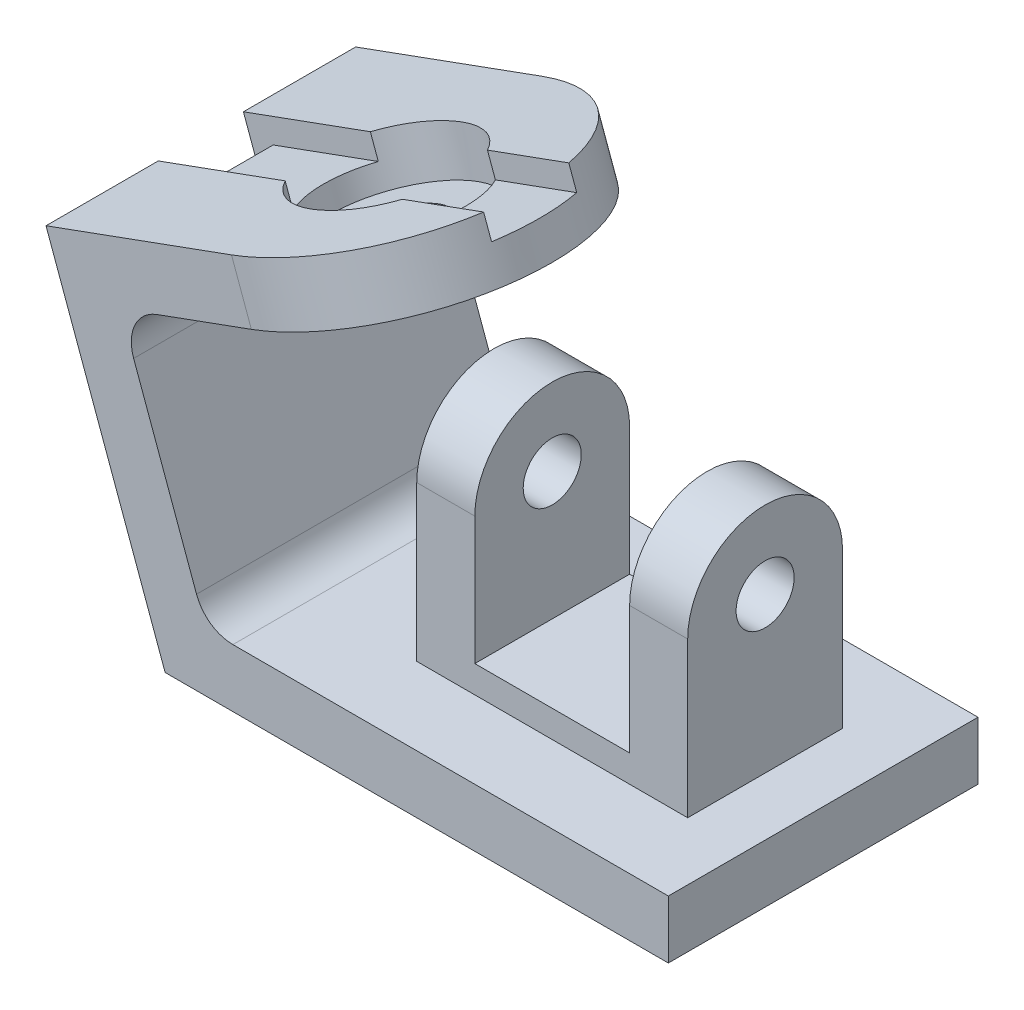
ISO-10303-21;
HEADER;
FILE_DESCRIPTION(('STEP AP214'),'2;1');
FILE_NAME('part.step','',(''),(''),'','','');
FILE_SCHEMA(('AUTOMOTIVE_DESIGN { 1 0 10303 214 1 1 1 1 }'));
ENDSEC;
DATA;
#1=APPLICATION_CONTEXT('core data for automotive mechanical design processes');
#2=APPLICATION_PROTOCOL_DEFINITION('international standard','automotive_design',2000,#1);
#3=PRODUCT_CONTEXT('',#1,'mechanical');
#4=PRODUCT('Part','Part','',(#3));
#5=PRODUCT_RELATED_PRODUCT_CATEGORY('part','',(#4));
#6=PRODUCT_DEFINITION_FORMATION('','',#4);
#7=PRODUCT_DEFINITION_CONTEXT('part definition',#1,'design');
#8=PRODUCT_DEFINITION('design','',#6,#7);
#9=PRODUCT_DEFINITION_SHAPE('','',#8);
#10=(LENGTH_UNIT() NAMED_UNIT(*) SI_UNIT(.MILLI.,.METRE.));
#11=(NAMED_UNIT(*) PLANE_ANGLE_UNIT() SI_UNIT($,.RADIAN.));
#12=(NAMED_UNIT(*) SI_UNIT($,.STERADIAN.) SOLID_ANGLE_UNIT());
#13=UNCERTAINTY_MEASURE_WITH_UNIT(LENGTH_MEASURE(1.E-05),#10,'distance_accuracy_value','');
#14=(GEOMETRIC_REPRESENTATION_CONTEXT(3) GLOBAL_UNCERTAINTY_ASSIGNED_CONTEXT((#13)) GLOBAL_UNIT_ASSIGNED_CONTEXT((#10,
#11,#12)) REPRESENTATION_CONTEXT('',''));
#15=CARTESIAN_POINT('',(0.,0.,0.));
#16=DIRECTION('',(0.,0.,1.));
#17=DIRECTION('',(1.,0.,0.));
#18=AXIS2_PLACEMENT_3D('',#15,#16,#17);
#19=CARTESIAN_POINT('',(45.,55.,-40.));
#20=DIRECTION('',(1.,0.,0.));
#21=DIRECTION('',(0.,0.,-1.));
#22=AXIS2_PLACEMENT_3D('',#19,#20,#21);
#23=CYLINDRICAL_SURFACE('',#22,20.);
#24=CARTESIAN_POINT('',(60.,55.,-40.));
#25=DIRECTION('',(-1.,0.,0.));
#26=DIRECTION('',(0.,0.,1.));
#27=AXIS2_PLACEMENT_3D('',#24,#25,#26);
#28=CIRCLE('',#27,20.);
#29=CARTESIAN_POINT('',(60.,55.,-60.));
#30=VERTEX_POINT('',#29);
#31=CARTESIAN_POINT('',(60.,55.,-20.));
#32=VERTEX_POINT('',#31);
#33=EDGE_CURVE('E235',#30,#32,#28,.F.);
#34=ORIENTED_EDGE('',*,*,#33,.F.);
#35=DIRECTION('',(1.,0.,0.));
#36=VECTOR('',#35,1.);
#37=CARTESIAN_POINT('',(45.,55.,-60.));
#38=LINE('',#37,#36);
#39=CARTESIAN_POINT('',(45.,55.,-60.));
#40=VERTEX_POINT('',#39);
#41=EDGE_CURVE('E309',#40,#30,#38,.T.);
#42=ORIENTED_EDGE('',*,*,#41,.F.);
#43=CARTESIAN_POINT('',(45.,55.,-40.));
#44=DIRECTION('',(1.,0.,0.));
#45=DIRECTION('',(0.,0.,1.));
#46=AXIS2_PLACEMENT_3D('',#43,#44,#45);
#47=CIRCLE('',#46,20.);
#48=CARTESIAN_POINT('',(45.,55.,-20.));
#49=VERTEX_POINT('',#48);
#50=EDGE_CURVE('E278',#40,#49,#47,.T.);
#51=ORIENTED_EDGE('',*,*,#50,.T.);
#52=DIRECTION('',(1.,0.,0.));
#53=VECTOR('',#52,1.);
#54=CARTESIAN_POINT('',(45.,55.,-20.));
#55=LINE('',#54,#53);
#56=EDGE_CURVE('E305',#49,#32,#55,.T.);
#57=ORIENTED_EDGE('',*,*,#56,.T.);
#58=EDGE_LOOP('',(#34,#42,#51,#57));
#59=FACE_BOUND('',#58,.T.);
#60=ADVANCED_FACE('F43',(#59),#23,.T.);
#61=CARTESIAN_POINT('',(19.1946316207254,96.3772074556254,-40.));
#62=DIRECTION('',(-0.342020143325666,0.939692620785909,0.));
#63=DIRECTION('',(-0.939692620785909,-0.342020143325666,0.));
#64=AXIS2_PLACEMENT_3D('',#61,#62,#63);
#65=PLANE('',#64);
#66=DIRECTION('',(-0.939692620785909,-0.342020143325666,0.));
#67=VECTOR('',#66,1.);
#68=CARTESIAN_POINT('',(-28.729692039356,78.9341801460164,-51.));
#69=LINE('',#68,#67);
#70=CARTESIAN_POINT('',(4.06441315107677,90.8702582947286,-51.));
#71=VERTEX_POINT('',#70);
#72=CARTESIAN_POINT('',(-23.0915363146405,80.9863010059704,-51.));
#73=VERTEX_POINT('',#72);
#74=EDGE_CURVE('E367',#71,#73,#69,.T.);
#75=ORIENTED_EDGE('',*,*,#74,.T.);
#76=DIRECTION('',(0.,0.,1.));
#77=VECTOR('',#76,1.);
#78=CARTESIAN_POINT('',(-23.0915363146405,80.9863010059704,-40.));
#79=LINE('',#78,#77);
#80=CARTESIAN_POINT('',(-23.0915363146405,80.9863010059704,-29.));
#81=VERTEX_POINT('',#80);
#82=EDGE_CURVE('E335',#73,#81,#79,.T.);
#83=ORIENTED_EDGE('',*,*,#82,.T.);
#84=DIRECTION('',(0.939692620785909,0.342020143325666,0.));
#85=VECTOR('',#84,1.);
#86=CARTESIAN_POINT('',(-28.729692039356,78.9341801460164,-29.));
#87=LINE('',#86,#85);
#88=CARTESIAN_POINT('',(4.06441315107677,90.8702582947286,-29.));
#89=VERTEX_POINT('',#88);
#90=EDGE_CURVE('E374',#81,#89,#87,.T.);
#91=ORIENTED_EDGE('',*,*,#90,.T.);
#92=CARTESIAN_POINT('',(19.1946316207254,96.3772074556254,-40.));
#93=DIRECTION('',(-0.342020143325666,0.939692620785909,0.));
#94=DIRECTION('',(-0.939692620785909,-0.342020143325666,0.));
#95=AXIS2_PLACEMENT_3D('',#92,#93,#94);
#96=CIRCLE('',#95,19.5);
#97=EDGE_CURVE('E354',#71,#89,#96,.T.);
#98=ORIENTED_EDGE('',*,*,#97,.F.);
#99=EDGE_LOOP('',(#75,#83,#91,#98));
#100=FACE_BOUND('',#99,.T.);
#101=ADVANCED_FACE('F613',(#100),#65,.T.);
#102=CARTESIAN_POINT('',(63.1318732289309,-24.3393717360423,-40.));
#103=DIRECTION('',(-0.342020143325666,0.939692620785909,0.));
#104=DIRECTION('',(-0.939692620785909,-0.342020143325666,0.));
#105=AXIS2_PLACEMENT_3D('',#102,#103,#104);
#106=CYLINDRICAL_SURFACE('',#105,9.5);
#107=CARTESIAN_POINT('',(22.2728129106564,87.9199738685522,-40.));
#108=DIRECTION('',(0.342020143325666,-0.939692620785909,0.));
#109=DIRECTION('',(0.939692620785909,0.342020143325666,0.));
#110=AXIS2_PLACEMENT_3D('',#107,#108,#109);
#111=CIRCLE('',#110,9.5);
#112=CARTESIAN_POINT('',(31.1998928081226,91.169165230146,-40.));
#113=VERTEX_POINT('',#112);
#114=EDGE_CURVE('E390',#113,#113,#111,.F.);
#115=ORIENTED_EDGE('',*,*,#114,.F.);
#116=EDGE_LOOP('',(#115));
#117=FACE_BOUND('',#116,.T.);
#118=CARTESIAN_POINT('',(21.2467524806794,90.7390517309099,-40.));
#119=DIRECTION('',(-0.342020143325666,0.939692620785909,0.));
#120=DIRECTION('',(-0.939692620785909,-0.342020143325666,0.));
#121=AXIS2_PLACEMENT_3D('',#118,#119,#120);
#122=CIRCLE('',#121,9.5);
#123=CARTESIAN_POINT('',(12.3196725832133,87.4898603693161,-40.));
#124=VERTEX_POINT('',#123);
#125=EDGE_CURVE('E362',#124,#124,#122,.F.);
#126=ORIENTED_EDGE('',*,*,#125,.F.);
#127=EDGE_LOOP('',(#126));
#128=FACE_BOUND('',#127,.T.);
#129=ADVANCED_FACE('F618',(#117,#128),#106,.F.);
#130=CARTESIAN_POINT('',(34.3248500903741,101.884156616522,-29.));
#131=VERTEX_POINT('',#130);
#132=CARTESIAN_POINT('',(34.3248500903741,101.884156616522,-51.));
#133=VERTEX_POINT('',#132);
#134=EDGE_CURVE('E347',#131,#133,#96,.T.);
#135=ORIENTED_EDGE('',*,*,#134,.F.);
#136=CARTESIAN_POINT('',(55.3331134051957,109.530539136744,-29.));
#137=VERTEX_POINT('',#136);
#138=EDGE_CURVE('E373',#131,#137,#87,.T.);
#139=ORIENTED_EDGE('',*,*,#138,.T.);
#140=CARTESIAN_POINT('',(19.1946316207254,96.3772074556254,-40.));
#141=DIRECTION('',(-0.342020143325666,0.939692620785909,0.));
#142=DIRECTION('',(-0.939692620785909,-0.342020143325666,0.));
#143=AXIS2_PLACEMENT_3D('',#140,#141,#142);
#144=CIRCLE('',#143,40.);
#145=CARTESIAN_POINT('',(55.3331134051957,109.530539136744,-51.));
#146=VERTEX_POINT('',#145);
#147=EDGE_CURVE('E363',#137,#146,#144,.T.);
#148=ORIENTED_EDGE('',*,*,#147,.T.);
#149=EDGE_CURVE('E369',#146,#133,#69,.T.);
#150=ORIENTED_EDGE('',*,*,#149,.T.);
#151=EDGE_LOOP('',(#135,#139,#148,#150));
#152=FACE_BOUND('',#151,.T.);
#153=ADVANCED_FACE('F621',(#152),#65,.T.);
#154=CARTESIAN_POINT('',(-28.729692039356,78.9341801460164,-29.));
#155=DIRECTION('',(0.,0.,1.));
#156=DIRECTION('',(1.,0.,0.));
#157=AXIS2_PLACEMENT_3D('',#154,#155,#156);
#158=PLANE('',#157);
#159=ORIENTED_EDGE('',*,*,#138,.F.);
#160=DIRECTION('',(-0.342020143325666,0.939692620785909,0.));
#161=VECTOR('',#160,1.);
#162=CARTESIAN_POINT('',(36.3769709503281,96.2460008918067,-29.));
#163=LINE('',#162,#161);
#164=CARTESIAN_POINT('',(32.2727292304201,107.522312341238,-29.));
#165=VERTEX_POINT('',#164);
#166=EDGE_CURVE('E353',#131,#165,#163,.T.);
#167=ORIENTED_EDGE('',*,*,#166,.T.);
#168=DIRECTION('',(0.939692620785909,0.342020143325666,0.));
#169=VECTOR('',#168,1.);
#170=CARTESIAN_POINT('',(-30.78181289931,84.5723358707319,-29.));
#171=LINE('',#170,#169);
#172=CARTESIAN_POINT('',(53.2809925452417,115.168694861459,-29.));
#173=VERTEX_POINT('',#172);
#174=EDGE_CURVE('E382',#165,#173,#171,.T.);
#175=ORIENTED_EDGE('',*,*,#174,.T.);
#176=DIRECTION('',(-0.342020143325666,0.939692620785909,0.));
#177=VECTOR('',#176,1.);
#178=CARTESIAN_POINT('',(55.3331134051957,109.530539136744,-29.));
#179=LINE('',#178,#177);
#180=EDGE_CURVE('E386',#137,#173,#179,.T.);
#181=ORIENTED_EDGE('',*,*,#180,.F.);
#182=EDGE_LOOP('',(#159,#167,#175,#181));
#183=FACE_BOUND('',#182,.T.);
#184=ADVANCED_FACE('F716',(#183),#158,.F.);
#185=CARTESIAN_POINT('',(-28.729692039356,78.9341801460164,-51.));
#186=DIRECTION('',(0.,0.,-1.));
#187=DIRECTION('',(-1.,0.,0.));
#188=AXIS2_PLACEMENT_3D('',#185,#186,#187);
#189=PLANE('',#188);
#190=DIRECTION('',(-0.342020143325666,0.939692620785909,0.));
#191=VECTOR('',#190,1.);
#192=CARTESIAN_POINT('',(-28.729692039356,78.9341801460164,-51.));
#193=LINE('',#192,#191);
#194=CARTESIAN_POINT('',(-11.6286848730727,31.949549106721,-51.));
#195=VERTEX_POINT('',#194);
#196=CARTESIAN_POINT('',(-30.78181289931,84.5723358707319,-51.));
#197=VERTEX_POINT('',#196);
#198=EDGE_CURVE('E394',#195,#197,#193,.T.);
#199=ORIENTED_EDGE('',*,*,#198,.F.);
#200=DIRECTION('',(-0.939692620785909,-0.342020143325666,0.));
#201=VECTOR('',#200,1.);
#202=CARTESIAN_POINT('',(-5.99052914835721,34.0016699666749,-51.));
#203=LINE('',#202,#201);
#204=CARTESIAN_POINT('',(-5.99052914835721,34.0016699666749,-51.));
#205=VERTEX_POINT('',#204);
#206=EDGE_CURVE('E327',#205,#195,#203,.T.);
#207=ORIENTED_EDGE('',*,*,#206,.F.);
#208=DIRECTION('',(0.342020143325666,-0.939692620785909,0.));
#209=VECTOR('',#208,1.);
#210=CARTESIAN_POINT('',(-25.1436571745945,86.6244567306859,-51.));
#211=LINE('',#210,#209);
#212=EDGE_CURVE('E320',#73,#205,#211,.T.);
#213=ORIENTED_EDGE('',*,*,#212,.F.);
#214=ORIENTED_EDGE('',*,*,#74,.F.);
#215=DIRECTION('',(-0.342020143325666,0.939692620785909,0.));
#216=VECTOR('',#215,1.);
#217=CARTESIAN_POINT('',(6.11653401103077,85.2321025700131,-51.));
#218=LINE('',#217,#216);
#219=CARTESIAN_POINT('',(2.01229229112277,96.508414019444,-51.));
#220=VERTEX_POINT('',#219);
#221=EDGE_CURVE('E491',#71,#220,#218,.T.);
#222=ORIENTED_EDGE('',*,*,#221,.T.);
#223=DIRECTION('',(-0.939692620785909,-0.342020143325666,0.));
#224=VECTOR('',#223,1.);
#225=CARTESIAN_POINT('',(-30.78181289931,84.5723358707319,-51.));
#226=LINE('',#225,#224);
#227=EDGE_CURVE('E383',#220,#197,#226,.T.);
#228=ORIENTED_EDGE('',*,*,#227,.T.);
#229=EDGE_LOOP('',(#199,#207,#213,#214,#222,#228));
#230=FACE_BOUND('',#229,.T.);
#231=ADVANCED_FACE('F713',(#230),#189,.F.);
#232=CARTESIAN_POINT('',(-30.78181289931,84.5723358707318,-80.));
#233=DIRECTION('',(-0.342020143325666,0.939692620785909,0.));
#234=DIRECTION('',(-0.939692620785909,-0.342020143325666,0.));
#235=AXIS2_PLACEMENT_3D('',#232,#233,#234);
#236=PLANE('',#235);
#237=CARTESIAN_POINT('',(17.1425107607714,102.015363180341,-40.));
#238=DIRECTION('',(-0.342020143325666,0.939692620785909,0.));
#239=DIRECTION('',(-0.939692620785909,-0.342020143325666,0.));
#240=AXIS2_PLACEMENT_3D('',#237,#238,#239);
#241=CIRCLE('',#240,19.5);
#242=CARTESIAN_POINT('',(2.01229229112277,96.508414019444,-29.));
#243=VERTEX_POINT('',#242);
#244=EDGE_CURVE('E348',#243,#165,#241,.T.);
#245=ORIENTED_EDGE('',*,*,#244,.F.);
#246=CARTESIAN_POINT('',(-30.78181289931,84.5723358707319,-29.));
#247=VERTEX_POINT('',#246);
#248=EDGE_CURVE('E368',#247,#243,#171,.T.);
#249=ORIENTED_EDGE('',*,*,#248,.F.);
#250=DIRECTION('',(0.,0.,1.));
#251=VECTOR('',#250,1.);
#252=CARTESIAN_POINT('',(-30.78181289931,84.5723358707318,-80.));
#253=LINE('',#252,#251);
#254=CARTESIAN_POINT('',(-30.78181289931,84.5723358707318,0.));
#255=VERTEX_POINT('',#254);
#256=EDGE_CURVE('E482',#247,#255,#253,.T.);
#257=ORIENTED_EDGE('',*,*,#256,.T.);
#258=DIRECTION('',(-0.939692620785909,-0.342020143325666,0.));
#259=VECTOR('',#258,1.);
#260=CARTESIAN_POINT('',(-30.78181289931,84.5723358707318,0.));
#261=LINE('',#260,#259);
#262=CARTESIAN_POINT('',(17.1425107607714,102.015363180341,0.));
#263=VERTEX_POINT('',#262);
#264=EDGE_CURVE('E467',#263,#255,#261,.T.);
#265=ORIENTED_EDGE('',*,*,#264,.F.);
#266=CARTESIAN_POINT('',(17.1425107607714,102.015363180341,-40.));
#267=DIRECTION('',(-0.342020143325666,0.939692620785909,0.));
#268=DIRECTION('',(0.939692620785909,0.342020143325666,0.));
#269=AXIS2_PLACEMENT_3D('',#266,#267,#268);
#270=CIRCLE('',#269,40.);
#271=EDGE_CURVE('E409',#263,#173,#270,.T.);
#272=ORIENTED_EDGE('',*,*,#271,.T.);
#273=ORIENTED_EDGE('',*,*,#174,.F.);
#274=EDGE_LOOP('',(#245,#249,#257,#265,#272,#273));
#275=FACE_BOUND('',#274,.T.);
#276=ADVANCED_FACE('F684',(#275),#236,.T.);
#277=CARTESIAN_POINT('',(130.,0.,-80.));
#278=DIRECTION('',(0.,-1.,0.));
#279=DIRECTION('',(1.,0.,0.));
#280=AXIS2_PLACEMENT_3D('',#277,#278,#279);
#281=PLANE('',#280);
#282=DIRECTION('',(1.,0.,0.));
#283=VECTOR('',#282,1.);
#284=CARTESIAN_POINT('',(130.,0.,0.));
#285=LINE('',#284,#283);
#286=CARTESIAN_POINT('',(0.,0.,0.));
#287=VERTEX_POINT('',#286);
#288=CARTESIAN_POINT('',(130.,0.,0.));
#289=VERTEX_POINT('',#288);
#290=EDGE_CURVE('E408',#287,#289,#285,.T.);
#291=ORIENTED_EDGE('',*,*,#290,.F.);
#292=DIRECTION('',(0.,0.,1.));
#293=VECTOR('',#292,1.);
#294=CARTESIAN_POINT('',(0.,0.,-80.));
#295=LINE('',#294,#293);
#296=CARTESIAN_POINT('',(0.,0.,-80.));
#297=VERTEX_POINT('',#296);
#298=EDGE_CURVE('E474',#297,#287,#295,.T.);
#299=ORIENTED_EDGE('',*,*,#298,.F.);
#300=DIRECTION('',(1.,0.,0.));
#301=VECTOR('',#300,1.);
#302=CARTESIAN_POINT('',(130.,0.,-80.));
#303=LINE('',#302,#301);
#304=CARTESIAN_POINT('',(130.,0.,-80.));
#305=VERTEX_POINT('',#304);
#306=EDGE_CURVE('E413',#297,#305,#303,.T.);
#307=ORIENTED_EDGE('',*,*,#306,.T.);
#308=DIRECTION('',(0.,0.,1.));
#309=VECTOR('',#308,1.);
#310=CARTESIAN_POINT('',(130.,0.,-80.));
#311=LINE('',#310,#309);
#312=EDGE_CURVE('E444',#305,#289,#311,.T.);
#313=ORIENTED_EDGE('',*,*,#312,.T.);
#314=EDGE_LOOP('',(#291,#299,#307,#313));
#315=FACE_BOUND('',#314,.T.);
#316=ADVANCED_FACE('F549',(#315),#281,.T.);
#317=CARTESIAN_POINT('',(0.,0.,-80.));
#318=DIRECTION('',(-0.939692620785909,-0.342020143325666,0.));
#319=DIRECTION('',(0.342020143325666,-0.939692620785909,0.));
#320=AXIS2_PLACEMENT_3D('',#317,#318,#319);
#321=PLANE('',#320);
#322=DIRECTION('',(-0.342020143325666,0.939692620785909,0.));
#323=VECTOR('',#322,1.);
#324=CARTESIAN_POINT('',(-28.729692039356,78.9341801460164,-29.));
#325=LINE('',#324,#323);
#326=CARTESIAN_POINT('',(-11.6286848730727,31.949549106721,-29.));
#327=VERTEX_POINT('',#326);
#328=EDGE_CURVE('E391',#327,#247,#325,.T.);
#329=ORIENTED_EDGE('',*,*,#328,.F.);
#330=DIRECTION('',(0.,0.,1.));
#331=VECTOR('',#330,1.);
#332=CARTESIAN_POINT('',(-11.6286848730727,31.949549106721,-51.));
#333=LINE('',#332,#331);
#334=EDGE_CURVE('E304',#195,#327,#333,.T.);
#335=ORIENTED_EDGE('',*,*,#334,.F.);
#336=ORIENTED_EDGE('',*,*,#198,.T.);
#337=CARTESIAN_POINT('',(-30.78181289931,84.5723358707318,-80.));
#338=VERTEX_POINT('',#337);
#339=EDGE_CURVE('E478',#338,#197,#253,.T.);
#340=ORIENTED_EDGE('',*,*,#339,.F.);
#341=DIRECTION('',(0.342020143325666,-0.939692620785909,0.));
#342=VECTOR('',#341,1.);
#343=CARTESIAN_POINT('',(0.,0.,-80.));
#344=LINE('',#343,#342);
#345=EDGE_CURVE('E440',#338,#297,#344,.T.);
#346=ORIENTED_EDGE('',*,*,#345,.T.);
#347=ORIENTED_EDGE('',*,*,#298,.T.);
#348=DIRECTION('',(0.342020143325666,-0.939692620785909,0.));
#349=VECTOR('',#348,1.);
#350=CARTESIAN_POINT('',(0.,0.,0.));
#351=LINE('',#350,#349);
#352=EDGE_CURVE('E418',#255,#287,#351,.T.);
#353=ORIENTED_EDGE('',*,*,#352,.F.);
#354=ORIENTED_EDGE('',*,*,#256,.F.);
#355=EDGE_LOOP('',(#329,#335,#336,#340,#346,#347,#353,#354));
#356=FACE_BOUND('',#355,.T.);
#357=ADVANCED_FACE('F553',(#356),#321,.T.);
#358=CARTESIAN_POINT('',(32.2727292304201,107.522312341238,-51.));
#359=VERTEX_POINT('',#358);
#360=EDGE_CURVE('E342',#359,#220,#241,.T.);
#361=ORIENTED_EDGE('',*,*,#360,.F.);
#362=CARTESIAN_POINT('',(53.2809925452417,115.168694861459,-51.));
#363=VERTEX_POINT('',#362);
#364=EDGE_CURVE('E378',#363,#359,#226,.T.);
#365=ORIENTED_EDGE('',*,*,#364,.F.);
#366=CARTESIAN_POINT('',(17.1425107607714,102.015363180341,-80.));
#367=VERTEX_POINT('',#366);
#368=EDGE_CURVE('E403',#363,#367,#270,.T.);
#369=ORIENTED_EDGE('',*,*,#368,.T.);
#370=DIRECTION('',(-0.939692620785909,-0.342020143325666,0.));
#371=VECTOR('',#370,1.);
#372=CARTESIAN_POINT('',(-30.78181289931,84.5723358707318,-80.));
#373=LINE('',#372,#371);
#374=EDGE_CURVE('E436',#367,#338,#373,.T.);
#375=ORIENTED_EDGE('',*,*,#374,.T.);
#376=ORIENTED_EDGE('',*,*,#339,.T.);
#377=ORIENTED_EDGE('',*,*,#227,.F.);
#378=EDGE_LOOP('',(#361,#365,#369,#375,#376,#377));
#379=FACE_BOUND('',#378,.T.);
#380=ADVANCED_FACE('F559',(#379),#236,.T.);
#381=CARTESIAN_POINT('',(22.2728129106564,87.9199738685522,-80.));
#382=DIRECTION('',(0.342020143325666,-0.939692620785909,0.));
#383=DIRECTION('',(0.939692620785909,0.342020143325666,0.));
#384=AXIS2_PLACEMENT_3D('',#381,#382,#383);
#385=PLANE('',#384);
#386=ORIENTED_EDGE('',*,*,#114,.T.);
#387=EDGE_LOOP('',(#386));
#388=FACE_BOUND('',#387,.T.);
#389=DIRECTION('',(0.939692620785909,0.342020143325666,0.));
#390=VECTOR('',#389,1.);
#391=CARTESIAN_POINT('',(22.2728129106564,87.9199738685522,0.));
#392=LINE('',#391,#390);
#393=CARTESIAN_POINT('',(-2.15919522977722,79.0274501420848,0.));
#394=VERTEX_POINT('',#393);
#395=CARTESIAN_POINT('',(22.2728129106564,87.9199738685522,0.));
#396=VERTEX_POINT('',#395);
#397=EDGE_CURVE('E460',#394,#396,#392,.T.);
#398=ORIENTED_EDGE('',*,*,#397,.F.);
#399=DIRECTION('',(0.,0.,1.));
#400=VECTOR('',#399,1.);
#401=CARTESIAN_POINT('',(-2.15919522977723,79.0274501420848,-80.));
#402=LINE('',#401,#400);
#403=CARTESIAN_POINT('',(-2.15919522977722,79.0274501420848,-80.));
#404=VERTEX_POINT('',#403);
#405=EDGE_CURVE('E520',#394,#404,#402,.F.);
#406=ORIENTED_EDGE('',*,*,#405,.T.);
#407=DIRECTION('',(0.939692620785909,0.342020143325666,0.));
#408=VECTOR('',#407,1.);
#409=CARTESIAN_POINT('',(22.2728129106564,87.9199738685522,-80.));
#410=LINE('',#409,#408);
#411=CARTESIAN_POINT('',(22.2728129106564,87.9199738685522,-80.));
#412=VERTEX_POINT('',#411);
#413=EDGE_CURVE('E429',#404,#412,#410,.T.);
#414=ORIENTED_EDGE('',*,*,#413,.T.);
#415=CARTESIAN_POINT('',(22.2728129106564,87.9199738685522,-40.));
#416=DIRECTION('',(-0.342020143325666,0.939692620785909,0.));
#417=DIRECTION('',(0.939692620785909,0.342020143325666,0.));
#418=AXIS2_PLACEMENT_3D('',#415,#416,#417);
#419=CIRCLE('',#418,40.);
#420=EDGE_CURVE('E404',#396,#412,#419,.T.);
#421=ORIENTED_EDGE('',*,*,#420,.F.);
#422=EDGE_LOOP('',(#398,#406,#414,#421));
#423=FACE_BOUND('',#422,.T.);
#424=ADVANCED_FACE('F572',(#388,#423),#385,.T.);
#425=CARTESIAN_POINT('',(-11.5561214376363,75.6072487088282,-80.));
#426=DIRECTION('',(0.939692620785909,0.342020143325667,0.));
#427=DIRECTION('',(-0.342020143325667,0.939692620785909,0.));
#428=AXIS2_PLACEMENT_3D('',#425,#426,#427);
#429=PLANE('',#428);
#430=DIRECTION('',(-0.342020143325667,0.939692620785909,0.));
#431=VECTOR('',#430,1.);
#432=CARTESIAN_POINT('',(-11.5561214376363,75.6072487088282,-80.));
#433=LINE('',#432,#431);
#434=CARTESIAN_POINT('',(8.10826224738373,21.5797985667433,-80.));
#435=VERTEX_POINT('',#434);
#436=CARTESIAN_POINT('',(-8.13592000437966,66.2103225009691,-80.));
#437=VERTEX_POINT('',#436);
#438=EDGE_CURVE('E425',#435,#437,#433,.T.);
#439=ORIENTED_EDGE('',*,*,#438,.T.);
#440=DIRECTION('',(0.,0.,1.));
#441=VECTOR('',#440,1.);
#442=CARTESIAN_POINT('',(-8.13592000437966,66.2103225009691,0.));
#443=LINE('',#442,#441);
#444=CARTESIAN_POINT('',(-8.13592000437966,66.2103225009691,0.));
#445=VERTEX_POINT('',#444);
#446=EDGE_CURVE('E516',#437,#445,#443,.T.);
#447=ORIENTED_EDGE('',*,*,#446,.T.);
#448=DIRECTION('',(-0.342020143325667,0.939692620785909,0.));
#449=VECTOR('',#448,1.);
#450=CARTESIAN_POINT('',(-11.5561214376363,75.6072487088282,0.));
#451=LINE('',#450,#449);
#452=CARTESIAN_POINT('',(8.10826224738373,21.5797985667433,0.));
#453=VERTEX_POINT('',#452);
#454=EDGE_CURVE('E456',#453,#445,#451,.T.);
#455=ORIENTED_EDGE('',*,*,#454,.F.);
#456=DIRECTION('',(0.,0.,1.));
#457=VECTOR('',#456,1.);
#458=CARTESIAN_POINT('',(8.10826224738373,21.5797985667433,-80.));
#459=LINE('',#458,#457);
#460=EDGE_CURVE('E507',#453,#435,#459,.F.);
#461=ORIENTED_EDGE('',*,*,#460,.T.);
#462=EDGE_LOOP('',(#439,#447,#455,#461));
#463=FACE_BOUND('',#462,.T.);
#464=ADVANCED_FACE('F537',(#463),#429,.T.);
#465=CARTESIAN_POINT('',(10.5031130731457,15.,-80.));
#466=DIRECTION('',(0.,1.,0.));
#467=DIRECTION('',(0.,0.,1.));
#468=AXIS2_PLACEMENT_3D('',#465,#466,#467);
#469=PLANE('',#468);
#470=DIRECTION('',(0.,0.,-1.));
#471=VECTOR('',#470,1.);
#472=CARTESIAN_POINT('',(45.,15.,-60.));
#473=LINE('',#472,#471);
#474=CARTESIAN_POINT('',(45.,15.,-20.));
#475=VERTEX_POINT('',#474);
#476=CARTESIAN_POINT('',(45.,15.,-60.));
#477=VERTEX_POINT('',#476);
#478=EDGE_CURVE('E269',#475,#477,#473,.T.);
#479=ORIENTED_EDGE('',*,*,#478,.T.);
#480=DIRECTION('',(1.,0.,0.));
#481=VECTOR('',#480,1.);
#482=CARTESIAN_POINT('',(45.,15.,-60.));
#483=LINE('',#482,#481);
#484=CARTESIAN_POINT('',(115.,15.,-60.));
#485=VERTEX_POINT('',#484);
#486=EDGE_CURVE('E286',#477,#485,#483,.T.);
#487=ORIENTED_EDGE('',*,*,#486,.T.);
#488=DIRECTION('',(0.,0.,-1.));
#489=VECTOR('',#488,1.);
#490=CARTESIAN_POINT('',(115.,15.,-60.));
#491=LINE('',#490,#489);
#492=CARTESIAN_POINT('',(115.,15.,-20.));
#493=VERTEX_POINT('',#492);
#494=EDGE_CURVE('E268',#493,#485,#491,.T.);
#495=ORIENTED_EDGE('',*,*,#494,.F.);
#496=DIRECTION('',(1.,0.,0.));
#497=VECTOR('',#496,1.);
#498=CARTESIAN_POINT('',(45.,15.,-20.));
#499=LINE('',#498,#497);
#500=EDGE_CURVE('E300',#475,#493,#499,.T.);
#501=ORIENTED_EDGE('',*,*,#500,.F.);
#502=EDGE_LOOP('',(#479,#487,#495,#501));
#503=FACE_BOUND('',#502,.T.);
#504=DIRECTION('',(-1.,0.,0.));
#505=VECTOR('',#504,1.);
#506=CARTESIAN_POINT('',(10.5031130731457,15.,-80.));
#507=LINE('',#506,#505);
#508=CARTESIAN_POINT('',(130.,15.,-80.));
#509=VERTEX_POINT('',#508);
#510=CARTESIAN_POINT('',(17.5051884552428,15.,-80.));
#511=VERTEX_POINT('',#510);
#512=EDGE_CURVE('E422',#509,#511,#507,.T.);
#513=ORIENTED_EDGE('',*,*,#512,.T.);
#514=DIRECTION('',(0.,0.,1.));
#515=VECTOR('',#514,1.);
#516=CARTESIAN_POINT('',(17.5051884552428,15.,0.));
#517=LINE('',#516,#515);
#518=CARTESIAN_POINT('',(17.5051884552428,15.,0.));
#519=VERTEX_POINT('',#518);
#520=EDGE_CURVE('E523',#511,#519,#517,.T.);
#521=ORIENTED_EDGE('',*,*,#520,.T.);
#522=DIRECTION('',(-1.,0.,0.));
#523=VECTOR('',#522,1.);
#524=CARTESIAN_POINT('',(10.5031130731457,15.,0.));
#525=LINE('',#524,#523);
#526=CARTESIAN_POINT('',(130.,15.,0.));
#527=VERTEX_POINT('',#526);
#528=EDGE_CURVE('E452',#527,#519,#525,.T.);
#529=ORIENTED_EDGE('',*,*,#528,.F.);
#530=DIRECTION('',(0.,0.,1.));
#531=VECTOR('',#530,1.);
#532=CARTESIAN_POINT('',(130.,15.,-80.));
#533=LINE('',#532,#531);
#534=EDGE_CURVE('E483',#509,#527,#533,.T.);
#535=ORIENTED_EDGE('',*,*,#534,.F.);
#536=EDGE_LOOP('',(#513,#521,#529,#535));
#537=FACE_BOUND('',#536,.T.);
#538=ADVANCED_FACE('F540',(#503,#537),#469,.T.);
#539=CARTESIAN_POINT('',(130.,15.,-80.));
#540=DIRECTION('',(1.,0.,0.));
#541=DIRECTION('',(0.,0.,-1.));
#542=AXIS2_PLACEMENT_3D('',#539,#540,#541);
#543=PLANE('',#542);
#544=DIRECTION('',(0.,1.,0.));
#545=VECTOR('',#544,1.);
#546=CARTESIAN_POINT('',(130.,15.,0.));
#547=LINE('',#546,#545);
#548=EDGE_CURVE('E448',#289,#527,#547,.T.);
#549=ORIENTED_EDGE('',*,*,#548,.F.);
#550=ORIENTED_EDGE('',*,*,#312,.F.);
#551=DIRECTION('',(0.,1.,0.));
#552=VECTOR('',#551,1.);
#553=CARTESIAN_POINT('',(130.,15.,-80.));
#554=LINE('',#553,#552);
#555=EDGE_CURVE('E417',#305,#509,#554,.T.);
#556=ORIENTED_EDGE('',*,*,#555,.T.);
#557=ORIENTED_EDGE('',*,*,#534,.T.);
#558=EDGE_LOOP('',(#549,#550,#556,#557));
#559=FACE_BOUND('',#558,.T.);
#560=ADVANCED_FACE('F546',(#559),#543,.T.);
#561=CARTESIAN_POINT('',(0.,0.,-80.));
#562=DIRECTION('',(0.,0.,1.));
#563=DIRECTION('',(1.,0.,0.));
#564=AXIS2_PLACEMENT_3D('',#561,#562,#563);
#565=PLANE('',#564);
#566=ORIENTED_EDGE('',*,*,#306,.F.);
#567=ORIENTED_EDGE('',*,*,#345,.F.);
#568=ORIENTED_EDGE('',*,*,#374,.F.);
#569=DIRECTION('',(-0.342020143325666,0.93969262078591,0.));
#570=VECTOR('',#569,1.);
#571=CARTESIAN_POINT('',(17.1425107607714,102.015363180341,-80.));
#572=LINE('',#571,#570);
#573=EDGE_CURVE('E432',#412,#367,#572,.T.);
#574=ORIENTED_EDGE('',*,*,#573,.F.);
#575=ORIENTED_EDGE('',*,*,#413,.F.);
#576=CARTESIAN_POINT('',(1.26100620347944,69.6305239342257,-80.));
#577=DIRECTION('',(0.,0.,1.));
#578=DIRECTION('',(1.,0.,0.));
#579=AXIS2_PLACEMENT_3D('',#576,#577,#578);
#580=CIRCLE('',#579,10.);
#581=EDGE_CURVE('E529',#404,#437,#580,.T.);
#582=ORIENTED_EDGE('',*,*,#581,.T.);
#583=ORIENTED_EDGE('',*,*,#438,.F.);
#584=CARTESIAN_POINT('',(17.5051884552428,25.,-80.));
#585=DIRECTION('',(0.,0.,1.));
#586=DIRECTION('',(1.,0.,0.));
#587=AXIS2_PLACEMENT_3D('',#584,#585,#586);
#588=CIRCLE('',#587,10.);
#589=EDGE_CURVE('E11',#435,#511,#588,.T.);
#590=ORIENTED_EDGE('',*,*,#589,.T.);
#591=ORIENTED_EDGE('',*,*,#512,.F.);
#592=ORIENTED_EDGE('',*,*,#555,.F.);
#593=EDGE_LOOP('',(#566,#567,#568,#574,#575,#582,#583,#590,#591,#592));
#594=FACE_BOUND('',#593,.T.);
#595=ADVANCED_FACE('F543',(#594),#565,.F.);
#596=CARTESIAN_POINT('',(0.,0.,0.));
#597=DIRECTION('',(0.,0.,1.));
#598=DIRECTION('',(1.,0.,0.));
#599=AXIS2_PLACEMENT_3D('',#596,#597,#598);
#600=PLANE('',#599);
#601=ORIENTED_EDGE('',*,*,#290,.T.);
#602=ORIENTED_EDGE('',*,*,#548,.T.);
#603=ORIENTED_EDGE('',*,*,#528,.T.);
#604=CARTESIAN_POINT('',(17.5051884552428,25.,0.));
#605=DIRECTION('',(0.,0.,1.));
#606=DIRECTION('',(1.,0.,0.));
#607=AXIS2_PLACEMENT_3D('',#604,#605,#606);
#608=CIRCLE('',#607,10.);
#609=EDGE_CURVE('E52',#519,#453,#608,.F.);
#610=ORIENTED_EDGE('',*,*,#609,.T.);
#611=ORIENTED_EDGE('',*,*,#454,.T.);
#612=CARTESIAN_POINT('',(1.26100620347944,69.6305239342257,0.));
#613=DIRECTION('',(0.,0.,1.));
#614=DIRECTION('',(1.,0.,0.));
#615=AXIS2_PLACEMENT_3D('',#612,#613,#614);
#616=CIRCLE('',#615,10.);
#617=EDGE_CURVE('E526',#445,#394,#616,.F.);
#618=ORIENTED_EDGE('',*,*,#617,.T.);
#619=ORIENTED_EDGE('',*,*,#397,.T.);
#620=DIRECTION('',(-0.342020143325666,0.93969262078591,0.));
#621=VECTOR('',#620,1.);
#622=CARTESIAN_POINT('',(17.1425107607714,102.015363180341,0.));
#623=LINE('',#622,#621);
#624=EDGE_CURVE('E463',#396,#263,#623,.T.);
#625=ORIENTED_EDGE('',*,*,#624,.T.);
#626=ORIENTED_EDGE('',*,*,#264,.T.);
#627=ORIENTED_EDGE('',*,*,#352,.T.);
#628=EDGE_LOOP('',(#601,#602,#603,#610,#611,#618,#619,#625,#626,#627));
#629=FACE_BOUND('',#628,.T.);
#630=ADVANCED_FACE('F534',(#629),#600,.T.);
#631=CARTESIAN_POINT('',(22.2728129106564,87.9199738685522,-40.));
#632=DIRECTION('',(-0.342020143325666,0.939692620785909,0.));
#633=DIRECTION('',(-0.939692620785909,-0.342020143325666,0.));
#634=AXIS2_PLACEMENT_3D('',#631,#632,#633);
#635=CYLINDRICAL_SURFACE('',#634,40.);
#636=ORIENTED_EDGE('',*,*,#180,.T.);
#637=ORIENTED_EDGE('',*,*,#271,.F.);
#638=ORIENTED_EDGE('',*,*,#624,.F.);
#639=ORIENTED_EDGE('',*,*,#420,.T.);
#640=ORIENTED_EDGE('',*,*,#573,.T.);
#641=ORIENTED_EDGE('',*,*,#368,.F.);
#642=DIRECTION('',(-0.342020143325666,0.939692620785909,0.));
#643=VECTOR('',#642,1.);
#644=CARTESIAN_POINT('',(55.3331134051957,109.530539136744,-51.));
#645=LINE('',#644,#643);
#646=EDGE_CURVE('E377',#146,#363,#645,.T.);
#647=ORIENTED_EDGE('',*,*,#646,.F.);
#648=ORIENTED_EDGE('',*,*,#147,.F.);
#649=EDGE_LOOP('',(#636,#637,#638,#639,#640,#641,#647,#648));
#650=FACE_BOUND('',#649,.T.);
#651=ADVANCED_FACE('F566',(#650),#635,.T.);
#652=ORIENTED_EDGE('',*,*,#248,.T.);
#653=DIRECTION('',(-0.342020143325666,0.939692620785909,0.));
#654=VECTOR('',#653,1.);
#655=CARTESIAN_POINT('',(6.11653401103077,85.2321025700131,-29.));
#656=LINE('',#655,#654);
#657=EDGE_CURVE('E358',#243,#89,#656,.F.);
#658=ORIENTED_EDGE('',*,*,#657,.T.);
#659=ORIENTED_EDGE('',*,*,#90,.F.);
#660=DIRECTION('',(-0.342020143325666,0.939692620785909,0.));
#661=VECTOR('',#660,1.);
#662=CARTESIAN_POINT('',(-25.1436571745945,86.6244567306859,-29.));
#663=LINE('',#662,#661);
#664=CARTESIAN_POINT('',(-5.99052914835721,34.0016699666749,-29.));
#665=VERTEX_POINT('',#664);
#666=EDGE_CURVE('E317',#665,#81,#663,.T.);
#667=ORIENTED_EDGE('',*,*,#666,.F.);
#668=DIRECTION('',(-0.939692620785909,-0.342020143325666,0.));
#669=VECTOR('',#668,1.);
#670=CARTESIAN_POINT('',(-5.99052914835721,34.0016699666749,-29.));
#671=LINE('',#670,#669);
#672=EDGE_CURVE('E331',#665,#327,#671,.T.);
#673=ORIENTED_EDGE('',*,*,#672,.T.);
#674=ORIENTED_EDGE('',*,*,#328,.T.);
#675=EDGE_LOOP('',(#652,#658,#659,#667,#673,#674));
#676=FACE_BOUND('',#675,.T.);
#677=ADVANCED_FACE('F704',(#676),#158,.F.);
#678=ORIENTED_EDGE('',*,*,#364,.T.);
#679=DIRECTION('',(-0.342020143325666,0.939692620785909,0.));
#680=VECTOR('',#679,1.);
#681=CARTESIAN_POINT('',(36.3769709503281,96.2460008918067,-51.));
#682=LINE('',#681,#680);
#683=EDGE_CURVE('E477',#359,#133,#682,.F.);
#684=ORIENTED_EDGE('',*,*,#683,.T.);
#685=ORIENTED_EDGE('',*,*,#149,.F.);
#686=ORIENTED_EDGE('',*,*,#646,.T.);
#687=EDGE_LOOP('',(#678,#684,#685,#686));
#688=FACE_BOUND('',#687,.T.);
#689=ADVANCED_FACE('F708',(#688),#189,.F.);
#690=CARTESIAN_POINT('',(21.2467524806794,90.7390517309099,-40.));
#691=DIRECTION('',(-0.342020143325666,0.939692620785909,0.));
#692=DIRECTION('',(-0.939692620785909,-0.342020143325666,0.));
#693=AXIS2_PLACEMENT_3D('',#690,#691,#692);
#694=PLANE('',#693);
#695=CARTESIAN_POINT('',(21.2467524806794,90.7390517309099,-40.));
#696=DIRECTION('',(-0.342020143325666,0.939692620785909,0.));
#697=DIRECTION('',(-0.939692620785909,-0.342020143325666,0.));
#698=AXIS2_PLACEMENT_3D('',#695,#696,#697);
#699=CIRCLE('',#698,19.5);
#700=CARTESIAN_POINT('',(2.92274637535421,84.0696589360594,-40.));
#701=VERTEX_POINT('',#700);
#702=EDGE_CURVE('E343',#701,#701,#699,.T.);
#703=ORIENTED_EDGE('',*,*,#702,.T.);
#704=EDGE_LOOP('',(#703));
#705=FACE_BOUND('',#704,.T.);
#706=ORIENTED_EDGE('',*,*,#125,.T.);
#707=EDGE_LOOP('',(#706));
#708=FACE_BOUND('',#707,.T.);
#709=ADVANCED_FACE('F711',(#705,#708),#694,.T.);
#710=CARTESIAN_POINT('',(21.2467524806794,90.7390517309099,-40.));
#711=DIRECTION('',(-0.342020143325666,0.939692620785909,0.));
#712=DIRECTION('',(-0.939692620785909,-0.342020143325666,0.));
#713=AXIS2_PLACEMENT_3D('',#710,#711,#712);
#714=CYLINDRICAL_SURFACE('',#713,19.5);
#715=ORIENTED_EDGE('',*,*,#702,.F.);
#716=EDGE_LOOP('',(#715));
#717=FACE_BOUND('',#716,.T.);
#718=ORIENTED_EDGE('',*,*,#244,.T.);
#719=ORIENTED_EDGE('',*,*,#166,.F.);
#720=ORIENTED_EDGE('',*,*,#134,.T.);
#721=ORIENTED_EDGE('',*,*,#683,.F.);
#722=ORIENTED_EDGE('',*,*,#360,.T.);
#723=ORIENTED_EDGE('',*,*,#221,.F.);
#724=ORIENTED_EDGE('',*,*,#97,.T.);
#725=ORIENTED_EDGE('',*,*,#657,.F.);
#726=EDGE_LOOP('',(#718,#719,#720,#721,#722,#723,#724,#725));
#727=FACE_BOUND('',#726,.T.);
#728=ADVANCED_FACE('F718',(#717,#727),#714,.F.);
#729=CARTESIAN_POINT('',(-5.99052914835721,34.0016699666749,-51.));
#730=DIRECTION('',(0.342020143325666,-0.939692620785909,0.));
#731=DIRECTION('',(0.939692620785909,0.342020143325666,0.));
#732=AXIS2_PLACEMENT_3D('',#729,#730,#731);
#733=PLANE('',#732);
#734=ORIENTED_EDGE('',*,*,#334,.T.);
#735=ORIENTED_EDGE('',*,*,#672,.F.);
#736=DIRECTION('',(0.,0.,1.));
#737=VECTOR('',#736,1.);
#738=CARTESIAN_POINT('',(-5.99052914835721,34.0016699666749,-51.));
#739=LINE('',#738,#737);
#740=EDGE_CURVE('E323',#205,#665,#739,.T.);
#741=ORIENTED_EDGE('',*,*,#740,.F.);
#742=ORIENTED_EDGE('',*,*,#206,.T.);
#743=EDGE_LOOP('',(#734,#735,#741,#742));
#744=FACE_BOUND('',#743,.T.);
#745=ADVANCED_FACE('F633',(#744),#733,.F.);
#746=CARTESIAN_POINT('',(5.63815572471545,2.052120859954,0.));
#747=DIRECTION('',(-0.939692620785909,-0.342020143325666,0.));
#748=DIRECTION('',(0.342020143325666,-0.939692620785909,0.));
#749=AXIS2_PLACEMENT_3D('',#746,#747,#748);
#750=PLANE('',#749);
#751=ORIENTED_EDGE('',*,*,#212,.T.);
#752=ORIENTED_EDGE('',*,*,#740,.T.);
#753=ORIENTED_EDGE('',*,*,#666,.T.);
#754=ORIENTED_EDGE('',*,*,#82,.F.);
#755=EDGE_LOOP('',(#751,#752,#753,#754));
#756=FACE_BOUND('',#755,.T.);
#757=ADVANCED_FACE('F629',(#756),#750,.T.);
#758=CARTESIAN_POINT('',(45.,15.,-20.));
#759=DIRECTION('',(0.,0.,1.));
#760=DIRECTION('',(0.,-1.,0.));
#761=AXIS2_PLACEMENT_3D('',#758,#759,#760);
#762=PLANE('',#761);
#763=DIRECTION('',(0.,-1.,0.));
#764=VECTOR('',#763,1.);
#765=CARTESIAN_POINT('',(60.,22.,-20.));
#766=LINE('',#765,#764);
#767=CARTESIAN_POINT('',(60.,22.,-20.));
#768=VERTEX_POINT('',#767);
#769=EDGE_CURVE('E229',#32,#768,#766,.T.);
#770=ORIENTED_EDGE('',*,*,#769,.F.);
#771=ORIENTED_EDGE('',*,*,#56,.F.);
#772=DIRECTION('',(0.,-1.,0.));
#773=VECTOR('',#772,1.);
#774=CARTESIAN_POINT('',(45.,15.,-20.));
#775=LINE('',#774,#773);
#776=EDGE_CURVE('E282',#49,#475,#775,.T.);
#777=ORIENTED_EDGE('',*,*,#776,.T.);
#778=ORIENTED_EDGE('',*,*,#500,.T.);
#779=DIRECTION('',(0.,-1.,0.));
#780=VECTOR('',#779,1.);
#781=CARTESIAN_POINT('',(115.,15.,-20.));
#782=LINE('',#781,#780);
#783=CARTESIAN_POINT('',(115.,55.,-20.));
#784=VERTEX_POINT('',#783);
#785=EDGE_CURVE('E274',#784,#493,#782,.T.);
#786=ORIENTED_EDGE('',*,*,#785,.F.);
#787=CARTESIAN_POINT('',(100.,55.,-20.));
#788=VERTEX_POINT('',#787);
#789=EDGE_CURVE('E308',#788,#784,#55,.T.);
#790=ORIENTED_EDGE('',*,*,#789,.F.);
#791=DIRECTION('',(0.,1.,0.));
#792=VECTOR('',#791,1.);
#793=CARTESIAN_POINT('',(100.,22.,-20.));
#794=LINE('',#793,#792);
#795=CARTESIAN_POINT('',(100.,22.,-20.));
#796=VERTEX_POINT('',#795);
#797=EDGE_CURVE('E251',#796,#788,#794,.T.);
#798=ORIENTED_EDGE('',*,*,#797,.F.);
#799=DIRECTION('',(1.,0.,0.));
#800=VECTOR('',#799,1.);
#801=CARTESIAN_POINT('',(60.,22.,-20.));
#802=LINE('',#801,#800);
#803=EDGE_CURVE('E240',#768,#796,#802,.T.);
#804=ORIENTED_EDGE('',*,*,#803,.F.);
#805=EDGE_LOOP('',(#770,#771,#777,#778,#786,#790,#798,#804));
#806=FACE_BOUND('',#805,.T.);
#807=ADVANCED_FACE('F253',(#806),#762,.T.);
#808=CARTESIAN_POINT('',(100.,55.,-40.));
#809=DIRECTION('',(1.,0.,0.));
#810=DIRECTION('',(0.,0.,-1.));
#811=AXIS2_PLACEMENT_3D('',#808,#809,#810);
#812=CIRCLE('',#811,20.);
#813=CARTESIAN_POINT('',(100.,55.,-60.));
#814=VERTEX_POINT('',#813);
#815=EDGE_CURVE('E262',#788,#814,#812,.F.);
#816=ORIENTED_EDGE('',*,*,#815,.F.);
#817=ORIENTED_EDGE('',*,*,#789,.T.);
#818=CARTESIAN_POINT('',(115.,55.,-40.));
#819=DIRECTION('',(1.,0.,0.));
#820=DIRECTION('',(0.,0.,1.));
#821=AXIS2_PLACEMENT_3D('',#818,#819,#820);
#822=CIRCLE('',#821,20.);
#823=CARTESIAN_POINT('',(115.,55.,-60.));
#824=VERTEX_POINT('',#823);
#825=EDGE_CURVE('E294',#824,#784,#822,.T.);
#826=ORIENTED_EDGE('',*,*,#825,.F.);
#827=EDGE_CURVE('E313',#814,#824,#38,.T.);
#828=ORIENTED_EDGE('',*,*,#827,.F.);
#829=EDGE_LOOP('',(#816,#817,#826,#828));
#830=FACE_BOUND('',#829,.T.);
#831=ADVANCED_FACE('F599',(#830),#23,.T.);
#832=CARTESIAN_POINT('',(45.,55.,-60.));
#833=DIRECTION('',(0.,0.,-1.));
#834=DIRECTION('',(-1.,0.,0.));
#835=AXIS2_PLACEMENT_3D('',#832,#833,#834);
#836=PLANE('',#835);
#837=DIRECTION('',(0.,1.,0.));
#838=VECTOR('',#837,1.);
#839=CARTESIAN_POINT('',(60.,55.,-60.));
#840=LINE('',#839,#838);
#841=CARTESIAN_POINT('',(60.,22.,-60.));
#842=VERTEX_POINT('',#841);
#843=EDGE_CURVE('E504',#842,#30,#840,.T.);
#844=ORIENTED_EDGE('',*,*,#843,.F.);
#845=DIRECTION('',(-1.,0.,0.));
#846=VECTOR('',#845,1.);
#847=CARTESIAN_POINT('',(45.,22.,-60.));
#848=LINE('',#847,#846);
#849=CARTESIAN_POINT('',(100.,22.,-60.));
#850=VERTEX_POINT('',#849);
#851=EDGE_CURVE('E248',#850,#842,#848,.T.);
#852=ORIENTED_EDGE('',*,*,#851,.F.);
#853=DIRECTION('',(0.,-1.,0.));
#854=VECTOR('',#853,1.);
#855=CARTESIAN_POINT('',(100.,55.,-60.));
#856=LINE('',#855,#854);
#857=EDGE_CURVE('E500',#814,#850,#856,.T.);
#858=ORIENTED_EDGE('',*,*,#857,.F.);
#859=ORIENTED_EDGE('',*,*,#827,.T.);
#860=DIRECTION('',(0.,1.,0.));
#861=VECTOR('',#860,1.);
#862=CARTESIAN_POINT('',(115.,55.,-60.));
#863=LINE('',#862,#861);
#864=EDGE_CURVE('E290',#485,#824,#863,.T.);
#865=ORIENTED_EDGE('',*,*,#864,.F.);
#866=ORIENTED_EDGE('',*,*,#486,.F.);
#867=DIRECTION('',(0.,1.,0.));
#868=VECTOR('',#867,1.);
#869=CARTESIAN_POINT('',(45.,55.,-60.));
#870=LINE('',#869,#868);
#871=EDGE_CURVE('E273',#477,#40,#870,.T.);
#872=ORIENTED_EDGE('',*,*,#871,.T.);
#873=ORIENTED_EDGE('',*,*,#41,.T.);
#874=EDGE_LOOP('',(#844,#852,#858,#859,#865,#866,#872,#873));
#875=FACE_BOUND('',#874,.T.);
#876=ADVANCED_FACE('F596',(#875),#836,.T.);
#877=CARTESIAN_POINT('',(45.,55.,-40.));
#878=DIRECTION('',(-1.,0.,0.));
#879=DIRECTION('',(0.,0.,1.));
#880=AXIS2_PLACEMENT_3D('',#877,#878,#879);
#881=PLANE('',#880);
#882=CARTESIAN_POINT('',(45.,55.,-40.));
#883=DIRECTION('',(-1.,0.,0.));
#884=DIRECTION('',(0.,0.,1.));
#885=AXIS2_PLACEMENT_3D('',#882,#883,#884);
#886=CIRCLE('',#885,7.5);
#887=CARTESIAN_POINT('',(45.,55.,-32.5));
#888=VERTEX_POINT('',#887);
#889=EDGE_CURVE('E513',#888,#888,#886,.T.);
#890=ORIENTED_EDGE('',*,*,#889,.F.);
#891=EDGE_LOOP('',(#890));
#892=FACE_BOUND('',#891,.T.);
#893=ORIENTED_EDGE('',*,*,#478,.F.);
#894=ORIENTED_EDGE('',*,*,#776,.F.);
#895=ORIENTED_EDGE('',*,*,#50,.F.);
#896=ORIENTED_EDGE('',*,*,#871,.F.);
#897=EDGE_LOOP('',(#893,#894,#895,#896));
#898=FACE_BOUND('',#897,.T.);
#899=ADVANCED_FACE('F609',(#892,#898),#881,.T.);
#900=CARTESIAN_POINT('',(115.,55.,-40.));
#901=DIRECTION('',(-1.,0.,0.));
#902=DIRECTION('',(0.,0.,1.));
#903=AXIS2_PLACEMENT_3D('',#900,#901,#902);
#904=PLANE('',#903);
#905=CARTESIAN_POINT('',(115.,55.,-40.));
#906=DIRECTION('',(-1.,0.,0.));
#907=DIRECTION('',(0.,0.,1.));
#908=AXIS2_PLACEMENT_3D('',#905,#906,#907);
#909=CIRCLE('',#908,7.5);
#910=CARTESIAN_POINT('',(115.,55.,-32.5));
#911=VERTEX_POINT('',#910);
#912=EDGE_CURVE('E241',#911,#911,#909,.T.);
#913=ORIENTED_EDGE('',*,*,#912,.T.);
#914=EDGE_LOOP('',(#913));
#915=FACE_BOUND('',#914,.T.);
#916=ORIENTED_EDGE('',*,*,#494,.T.);
#917=ORIENTED_EDGE('',*,*,#864,.T.);
#918=ORIENTED_EDGE('',*,*,#825,.T.);
#919=ORIENTED_EDGE('',*,*,#785,.T.);
#920=EDGE_LOOP('',(#916,#917,#918,#919));
#921=FACE_BOUND('',#920,.T.);
#922=ADVANCED_FACE('F602',(#915,#921),#904,.F.);
#923=CARTESIAN_POINT('',(60.,22.,-80.));
#924=DIRECTION('',(-1.,0.,0.));
#925=DIRECTION('',(0.,0.,1.));
#926=AXIS2_PLACEMENT_3D('',#923,#924,#925);
#927=PLANE('',#926);
#928=CARTESIAN_POINT('',(60.,55.,-40.));
#929=DIRECTION('',(-1.,0.,0.));
#930=DIRECTION('',(0.,0.,1.));
#931=AXIS2_PLACEMENT_3D('',#928,#929,#930);
#932=CIRCLE('',#931,7.5);
#933=CARTESIAN_POINT('',(60.,55.,-32.5));
#934=VERTEX_POINT('',#933);
#935=EDGE_CURVE('E512',#934,#934,#932,.T.);
#936=ORIENTED_EDGE('',*,*,#935,.T.);
#937=EDGE_LOOP('',(#936));
#938=FACE_BOUND('',#937,.T.);
#939=ORIENTED_EDGE('',*,*,#33,.T.);
#940=ORIENTED_EDGE('',*,*,#769,.T.);
#941=DIRECTION('',(0.,0.,1.));
#942=VECTOR('',#941,1.);
#943=CARTESIAN_POINT('',(60.,22.,-80.));
#944=LINE('',#943,#942);
#945=EDGE_CURVE('E233',#842,#768,#944,.T.);
#946=ORIENTED_EDGE('',*,*,#945,.F.);
#947=ORIENTED_EDGE('',*,*,#843,.T.);
#948=EDGE_LOOP('',(#939,#940,#946,#947));
#949=FACE_BOUND('',#948,.T.);
#950=ADVANCED_FACE('F231',(#938,#949),#927,.F.);
#951=CARTESIAN_POINT('',(100.,22.,-80.));
#952=DIRECTION('',(1.,0.,0.));
#953=DIRECTION('',(0.,0.,-1.));
#954=AXIS2_PLACEMENT_3D('',#951,#952,#953);
#955=PLANE('',#954);
#956=CARTESIAN_POINT('',(100.,55.,-40.));
#957=DIRECTION('',(1.,0.,0.));
#958=DIRECTION('',(0.,0.,-1.));
#959=AXIS2_PLACEMENT_3D('',#956,#957,#958);
#960=CIRCLE('',#959,7.5);
#961=CARTESIAN_POINT('',(100.,55.,-47.5));
#962=VERTEX_POINT('',#961);
#963=EDGE_CURVE('E508',#962,#962,#960,.T.);
#964=ORIENTED_EDGE('',*,*,#963,.T.);
#965=EDGE_LOOP('',(#964));
#966=FACE_BOUND('',#965,.T.);
#967=ORIENTED_EDGE('',*,*,#815,.T.);
#968=ORIENTED_EDGE('',*,*,#857,.T.);
#969=DIRECTION('',(0.,0.,1.));
#970=VECTOR('',#969,1.);
#971=CARTESIAN_POINT('',(100.,22.,-80.));
#972=LINE('',#971,#970);
#973=EDGE_CURVE('E250',#850,#796,#972,.T.);
#974=ORIENTED_EDGE('',*,*,#973,.T.);
#975=ORIENTED_EDGE('',*,*,#797,.T.);
#976=EDGE_LOOP('',(#967,#968,#974,#975));
#977=FACE_BOUND('',#976,.T.);
#978=ADVANCED_FACE('F645',(#966,#977),#955,.F.);
#979=CARTESIAN_POINT('',(60.,22.,-80.));
#980=DIRECTION('',(0.,-1.,0.));
#981=DIRECTION('',(0.,0.,-1.));
#982=AXIS2_PLACEMENT_3D('',#979,#980,#981);
#983=PLANE('',#982);
#984=ORIENTED_EDGE('',*,*,#851,.T.);
#985=ORIENTED_EDGE('',*,*,#945,.T.);
#986=ORIENTED_EDGE('',*,*,#803,.T.);
#987=ORIENTED_EDGE('',*,*,#973,.F.);
#988=EDGE_LOOP('',(#984,#985,#986,#987));
#989=FACE_BOUND('',#988,.T.);
#990=ADVANCED_FACE('F245',(#989),#983,.F.);
#991=CARTESIAN_POINT('',(130.,55.,-40.));
#992=DIRECTION('',(-1.,0.,0.));
#993=DIRECTION('',(0.,0.,1.));
#994=AXIS2_PLACEMENT_3D('',#991,#992,#993);
#995=CYLINDRICAL_SURFACE('',#994,7.5);
#996=ORIENTED_EDGE('',*,*,#963,.F.);
#997=EDGE_LOOP('',(#996));
#998=FACE_BOUND('',#997,.T.);
#999=ORIENTED_EDGE('',*,*,#912,.F.);
#1000=EDGE_LOOP('',(#999));
#1001=FACE_BOUND('',#1000,.T.);
#1002=ADVANCED_FACE('F649',(#998,#1001),#995,.F.);
#1003=ORIENTED_EDGE('',*,*,#889,.T.);
#1004=EDGE_LOOP('',(#1003));
#1005=FACE_BOUND('',#1004,.T.);
#1006=ORIENTED_EDGE('',*,*,#935,.F.);
#1007=EDGE_LOOP('',(#1006));
#1008=FACE_BOUND('',#1007,.T.);
#1009=ADVANCED_FACE('F654',(#1005,#1008),#995,.F.);
#1010=CARTESIAN_POINT('',(1.26100620347944,69.6305239342257,-80.));
#1011=DIRECTION('',(0.,0.,-1.));
#1012=DIRECTION('',(-1.,0.,0.));
#1013=AXIS2_PLACEMENT_3D('',#1010,#1011,#1012);
#1014=CYLINDRICAL_SURFACE('',#1013,10.);
#1015=ORIENTED_EDGE('',*,*,#581,.F.);
#1016=ORIENTED_EDGE('',*,*,#405,.F.);
#1017=ORIENTED_EDGE('',*,*,#617,.F.);
#1018=ORIENTED_EDGE('',*,*,#446,.F.);
#1019=EDGE_LOOP('',(#1015,#1016,#1017,#1018));
#1020=FACE_BOUND('',#1019,.T.);
#1021=ADVANCED_FACE('F575',(#1020),#1014,.F.);
#1022=CARTESIAN_POINT('',(17.5051884552428,25.,-80.));
#1023=DIRECTION('',(0.,0.,-1.));
#1024=DIRECTION('',(-1.,0.,0.));
#1025=AXIS2_PLACEMENT_3D('',#1022,#1023,#1024);
#1026=CYLINDRICAL_SURFACE('',#1025,10.);
#1027=ORIENTED_EDGE('',*,*,#589,.F.);
#1028=ORIENTED_EDGE('',*,*,#460,.F.);
#1029=ORIENTED_EDGE('',*,*,#609,.F.);
#1030=ORIENTED_EDGE('',*,*,#520,.F.);
#1031=EDGE_LOOP('',(#1027,#1028,#1029,#1030));
#1032=FACE_BOUND('',#1031,.T.);
#1033=ADVANCED_FACE('F45',(#1032),#1026,.F.);
#1034=CLOSED_SHELL('',(#60,#101,#129,#153,#184,#231,#276,#316,#357,#380,#424,#464,#538,#560,
#595,#630,#651,#677,#689,#709,#728,#745,#757,#807,#831,#876,#899,#922,#950,#978,#990,#1002,
#1009,#1021,#1033));
#1035=MANIFOLD_SOLID_BREP('B2',#1034);
#1036=ADVANCED_BREP_SHAPE_REPRESENTATION('',(#18,#1035),#14);
#1037=SHAPE_DEFINITION_REPRESENTATION(#9,#1036);
ENDSEC;
END-ISO-10303-21;
